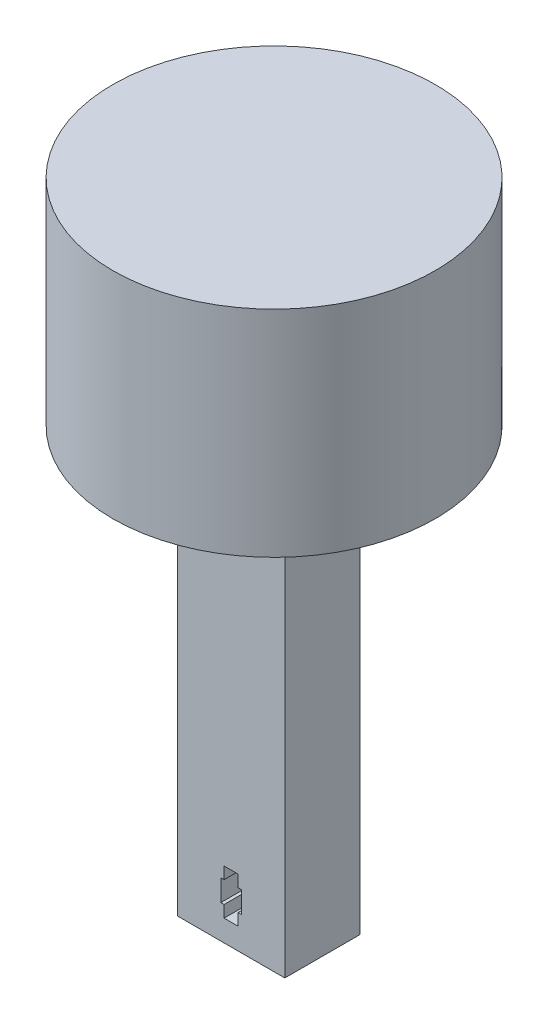
ISO-10303-21;
HEADER;
FILE_DESCRIPTION(('STEP AP214'),'2;1');
FILE_NAME('part.step','',(''),(''),'','','');
FILE_SCHEMA(('AUTOMOTIVE_DESIGN { 1 0 10303 214 1 1 1 1 }'));
ENDSEC;
DATA;
#1=APPLICATION_CONTEXT('core data for automotive mechanical design processes');
#2=APPLICATION_PROTOCOL_DEFINITION('international standard','automotive_design',2000,#1);
#3=PRODUCT_CONTEXT('',#1,'mechanical');
#4=PRODUCT('Part','Part','',(#3));
#5=PRODUCT_RELATED_PRODUCT_CATEGORY('part','',(#4));
#6=PRODUCT_DEFINITION_FORMATION('','',#4);
#7=PRODUCT_DEFINITION_CONTEXT('part definition',#1,'design');
#8=PRODUCT_DEFINITION('design','',#6,#7);
#9=PRODUCT_DEFINITION_SHAPE('','',#8);
#10=(LENGTH_UNIT() NAMED_UNIT(*) SI_UNIT(.MILLI.,.METRE.));
#11=(NAMED_UNIT(*) PLANE_ANGLE_UNIT() SI_UNIT($,.RADIAN.));
#12=(NAMED_UNIT(*) SI_UNIT($,.STERADIAN.) SOLID_ANGLE_UNIT());
#13=UNCERTAINTY_MEASURE_WITH_UNIT(LENGTH_MEASURE(1.E-05),#10,'distance_accuracy_value','');
#14=(GEOMETRIC_REPRESENTATION_CONTEXT(3) GLOBAL_UNCERTAINTY_ASSIGNED_CONTEXT((#13)) GLOBAL_UNIT_ASSIGNED_CONTEXT((#10,
#11,#12)) REPRESENTATION_CONTEXT('',''));
#15=CARTESIAN_POINT('',(0.,0.,0.));
#16=DIRECTION('',(0.,0.,1.));
#17=DIRECTION('',(1.,0.,0.));
#18=AXIS2_PLACEMENT_3D('',#15,#16,#17);
#19=CARTESIAN_POINT('',(0.649999999999998,-38.,-15.));
#20=DIRECTION('',(1.,0.,0.));
#21=DIRECTION('',(0.,0.,-1.));
#22=AXIS2_PLACEMENT_3D('',#19,#20,#21);
#23=PLANE('',#22);
#24=DIRECTION('',(0.,1.,0.));
#25=VECTOR('',#24,1.);
#26=CARTESIAN_POINT('',(0.649999999999998,-38.,4.));
#27=LINE('',#26,#25);
#28=CARTESIAN_POINT('',(0.649999999999998,-38.,4.));
#29=VERTEX_POINT('',#28);
#30=CARTESIAN_POINT('',(0.649999999999998,-36.9,4.));
#31=VERTEX_POINT('',#30);
#32=EDGE_CURVE('E260',#29,#31,#27,.T.);
#33=ORIENTED_EDGE('',*,*,#32,.T.);
#34=DIRECTION('',(0.,0.,-1.));
#35=VECTOR('',#34,1.);
#36=CARTESIAN_POINT('',(0.649999999999998,-36.9,-15.));
#37=LINE('',#36,#35);
#38=CARTESIAN_POINT('',(0.649999999999998,-36.9,-3.));
#39=VERTEX_POINT('',#38);
#40=EDGE_CURVE('E219',#31,#39,#37,.T.);
#41=ORIENTED_EDGE('',*,*,#40,.T.);
#42=DIRECTION('',(0.,1.,0.));
#43=VECTOR('',#42,1.);
#44=CARTESIAN_POINT('',(0.649999999999998,-40.,-3.));
#45=LINE('',#44,#43);
#46=CARTESIAN_POINT('',(0.649999999999999,-38.5,-3.));
#47=VERTEX_POINT('',#46);
#48=EDGE_CURVE('E288',#47,#39,#45,.T.);
#49=ORIENTED_EDGE('',*,*,#48,.F.);
#50=DIRECTION('',(0.,0.,-1.));
#51=VECTOR('',#50,1.);
#52=CARTESIAN_POINT('',(0.649999999999999,-38.5,-1.));
#53=LINE('',#52,#51);
#54=CARTESIAN_POINT('',(0.649999999999999,-38.5,-1.));
#55=VERTEX_POINT('',#54);
#56=EDGE_CURVE('E241',#55,#47,#53,.T.);
#57=ORIENTED_EDGE('',*,*,#56,.F.);
#58=DIRECTION('',(0.,1.,0.));
#59=VECTOR('',#58,1.);
#60=CARTESIAN_POINT('',(0.649999999999999,-38.5,-1.));
#61=LINE('',#60,#59);
#62=CARTESIAN_POINT('',(0.649999999999999,-38.,-1.));
#63=VERTEX_POINT('',#62);
#64=EDGE_CURVE('E229',#55,#63,#61,.T.);
#65=ORIENTED_EDGE('',*,*,#64,.T.);
#66=DIRECTION('',(0.,0.,1.));
#67=VECTOR('',#66,1.);
#68=CARTESIAN_POINT('',(0.649999999999998,-38.,-15.));
#69=LINE('',#68,#67);
#70=EDGE_CURVE('E274',#63,#29,#69,.T.);
#71=ORIENTED_EDGE('',*,*,#70,.T.);
#72=EDGE_LOOP('',(#33,#41,#49,#57,#65,#71));
#73=FACE_BOUND('',#72,.T.);
#74=ADVANCED_FACE('F39',(#73),#23,.F.);
#75=CARTESIAN_POINT('',(-0.650000000000002,-38.,-15.));
#76=DIRECTION('',(-1.,0.,0.));
#77=DIRECTION('',(0.,0.,1.));
#78=AXIS2_PLACEMENT_3D('',#75,#76,#77);
#79=PLANE('',#78);
#80=DIRECTION('',(0.,-1.,0.));
#81=VECTOR('',#80,1.);
#82=CARTESIAN_POINT('',(-0.650000000000001,-40.,-3.));
#83=LINE('',#82,#81);
#84=CARTESIAN_POINT('',(-0.650000000000002,-36.9,-3.));
#85=VERTEX_POINT('',#84);
#86=CARTESIAN_POINT('',(-0.649999999999999,-38.5,-3.));
#87=VERTEX_POINT('',#86);
#88=EDGE_CURVE('E276',#85,#87,#83,.T.);
#89=ORIENTED_EDGE('',*,*,#88,.F.);
#90=DIRECTION('',(0.,0.,1.));
#91=VECTOR('',#90,1.);
#92=CARTESIAN_POINT('',(-0.650000000000002,-36.9,-15.));
#93=LINE('',#92,#91);
#94=CARTESIAN_POINT('',(-0.650000000000002,-36.9,4.));
#95=VERTEX_POINT('',#94);
#96=EDGE_CURVE('E12',#85,#95,#93,.T.);
#97=ORIENTED_EDGE('',*,*,#96,.T.);
#98=DIRECTION('',(0.,-1.,0.));
#99=VECTOR('',#98,1.);
#100=CARTESIAN_POINT('',(-0.650000000000002,-38.,4.));
#101=LINE('',#100,#99);
#102=CARTESIAN_POINT('',(-0.650000000000002,-38.,4.));
#103=VERTEX_POINT('',#102);
#104=EDGE_CURVE('E266',#95,#103,#101,.T.);
#105=ORIENTED_EDGE('',*,*,#104,.T.);
#106=DIRECTION('',(0.,0.,1.));
#107=VECTOR('',#106,1.);
#108=CARTESIAN_POINT('',(-0.650000000000002,-38.,-15.));
#109=LINE('',#108,#107);
#110=CARTESIAN_POINT('',(-0.650000000000002,-38.,-1.));
#111=VERTEX_POINT('',#110);
#112=EDGE_CURVE('E277',#111,#103,#109,.T.);
#113=ORIENTED_EDGE('',*,*,#112,.F.);
#114=DIRECTION('',(0.,-1.,0.));
#115=VECTOR('',#114,1.);
#116=CARTESIAN_POINT('',(-0.649999999999999,-38.5,-1.));
#117=LINE('',#116,#115);
#118=CARTESIAN_POINT('',(-0.649999999999999,-38.5,-1.));
#119=VERTEX_POINT('',#118);
#120=EDGE_CURVE('E235',#111,#119,#117,.T.);
#121=ORIENTED_EDGE('',*,*,#120,.T.);
#122=DIRECTION('',(0.,0.,-1.));
#123=VECTOR('',#122,1.);
#124=CARTESIAN_POINT('',(-0.649999999999999,-38.5,-1.));
#125=LINE('',#124,#123);
#126=EDGE_CURVE('E249',#119,#87,#125,.T.);
#127=ORIENTED_EDGE('',*,*,#126,.T.);
#128=EDGE_LOOP('',(#89,#97,#105,#113,#121,#127));
#129=FACE_BOUND('',#128,.T.);
#130=ADVANCED_FACE('F375',(#129),#79,.F.);
#131=CARTESIAN_POINT('',(5.,-40.,-3.));
#132=DIRECTION('',(0.,0.,1.));
#133=DIRECTION('',(1.,0.,0.));
#134=AXIS2_PLACEMENT_3D('',#131,#132,#133);
#135=PLANE('',#134);
#136=DIRECTION('',(1.,0.,0.));
#137=VECTOR('',#136,1.);
#138=CARTESIAN_POINT('',(5.,0.,-3.));
#139=LINE('',#138,#137);
#140=CARTESIAN_POINT('',(-5.,0.,-3.));
#141=VERTEX_POINT('',#140);
#142=CARTESIAN_POINT('',(5.,0.,-3.));
#143=VERTEX_POINT('',#142);
#144=EDGE_CURVE('E305',#141,#143,#139,.T.);
#145=ORIENTED_EDGE('',*,*,#144,.T.);
#146=DIRECTION('',(0.,1.,0.));
#147=VECTOR('',#146,1.);
#148=CARTESIAN_POINT('',(5.,-40.,-3.));
#149=LINE('',#148,#147);
#150=CARTESIAN_POINT('',(5.,-40.,-3.));
#151=VERTEX_POINT('',#150);
#152=EDGE_CURVE('E318',#151,#143,#149,.T.);
#153=ORIENTED_EDGE('',*,*,#152,.F.);
#154=DIRECTION('',(1.,0.,0.));
#155=VECTOR('',#154,1.);
#156=CARTESIAN_POINT('',(5.,-40.,-3.));
#157=LINE('',#156,#155);
#158=CARTESIAN_POINT('',(-5.,-40.,-3.));
#159=VERTEX_POINT('',#158);
#160=EDGE_CURVE('E295',#159,#151,#157,.T.);
#161=ORIENTED_EDGE('',*,*,#160,.F.);
#162=DIRECTION('',(0.,1.,0.));
#163=VECTOR('',#162,1.);
#164=CARTESIAN_POINT('',(-5.,-40.,-3.));
#165=LINE('',#164,#163);
#166=EDGE_CURVE('E321',#159,#141,#165,.T.);
#167=ORIENTED_EDGE('',*,*,#166,.T.);
#168=EDGE_LOOP('',(#145,#153,#161,#167));
#169=FACE_BOUND('',#168,.T.);
#170=ORIENTED_EDGE('',*,*,#48,.T.);
#171=DIRECTION('',(1.,0.,0.));
#172=VECTOR('',#171,1.);
#173=CARTESIAN_POINT('',(5.,-36.9,-3.));
#174=LINE('',#173,#172);
#175=CARTESIAN_POINT('',(0.95,-36.9,-3.));
#176=VERTEX_POINT('',#175);
#177=EDGE_CURVE('E220',#39,#176,#174,.T.);
#178=ORIENTED_EDGE('',*,*,#177,.T.);
#179=DIRECTION('',(0.,1.,0.));
#180=VECTOR('',#179,1.);
#181=CARTESIAN_POINT('',(0.95,-40.,-3.));
#182=LINE('',#181,#180);
#183=CARTESIAN_POINT('',(0.95,-34.9,-3.));
#184=VERTEX_POINT('',#183);
#185=EDGE_CURVE('E226',#176,#184,#182,.T.);
#186=ORIENTED_EDGE('',*,*,#185,.T.);
#187=DIRECTION('',(-1.,0.,0.));
#188=VECTOR('',#187,1.);
#189=CARTESIAN_POINT('',(5.,-34.9,-3.));
#190=LINE('',#189,#188);
#191=CARTESIAN_POINT('',(0.649999999999998,-34.9,-3.));
#192=VERTEX_POINT('',#191);
#193=EDGE_CURVE('E179',#184,#192,#190,.T.);
#194=ORIENTED_EDGE('',*,*,#193,.T.);
#195=CARTESIAN_POINT('',(0.649999999999999,-33.3,-3.));
#196=VERTEX_POINT('',#195);
#197=EDGE_CURVE('E287',#192,#196,#45,.T.);
#198=ORIENTED_EDGE('',*,*,#197,.T.);
#199=DIRECTION('',(-1.,0.,0.));
#200=VECTOR('',#199,1.);
#201=CARTESIAN_POINT('',(-0.649999999999999,-33.3,-3.));
#202=LINE('',#201,#200);
#203=CARTESIAN_POINT('',(-0.649999999999999,-33.3,-3.));
#204=VERTEX_POINT('',#203);
#205=EDGE_CURVE('E228',#196,#204,#202,.T.);
#206=ORIENTED_EDGE('',*,*,#205,.T.);
#207=CARTESIAN_POINT('',(-0.650000000000001,-34.9,-3.));
#208=VERTEX_POINT('',#207);
#209=EDGE_CURVE('E284',#204,#208,#83,.T.);
#210=ORIENTED_EDGE('',*,*,#209,.T.);
#211=CARTESIAN_POINT('',(-0.95,-34.9,-3.));
#212=VERTEX_POINT('',#211);
#213=EDGE_CURVE('E62',#208,#212,#190,.T.);
#214=ORIENTED_EDGE('',*,*,#213,.T.);
#215=DIRECTION('',(0.,-1.,0.));
#216=VECTOR('',#215,1.);
#217=CARTESIAN_POINT('',(-0.95,-40.,-3.));
#218=LINE('',#217,#216);
#219=CARTESIAN_POINT('',(-0.95,-36.9,-3.));
#220=VERTEX_POINT('',#219);
#221=EDGE_CURVE('E223',#212,#220,#218,.T.);
#222=ORIENTED_EDGE('',*,*,#221,.T.);
#223=EDGE_CURVE('E216',#220,#85,#174,.T.);
#224=ORIENTED_EDGE('',*,*,#223,.T.);
#225=ORIENTED_EDGE('',*,*,#88,.T.);
#226=DIRECTION('',(1.,0.,0.));
#227=VECTOR('',#226,1.);
#228=CARTESIAN_POINT('',(-0.649999999999999,-38.5,-3.));
#229=LINE('',#228,#227);
#230=EDGE_CURVE('E244',#87,#47,#229,.T.);
#231=ORIENTED_EDGE('',*,*,#230,.T.);
#232=EDGE_LOOP('',(#170,#178,#186,#194,#198,#206,#210,#214,#222,#224,#225,#231));
#233=FACE_BOUND('',#232,.T.);
#234=ADVANCED_FACE('F349',(#169,#233),#135,.F.);
#235=CARTESIAN_POINT('',(-0.650000000000002,-38.,-15.));
#236=DIRECTION('',(0.,-1.,0.));
#237=DIRECTION('',(0.,0.,-1.));
#238=AXIS2_PLACEMENT_3D('',#235,#236,#237);
#239=PLANE('',#238);
#240=DIRECTION('',(1.,0.,0.));
#241=VECTOR('',#240,1.);
#242=CARTESIAN_POINT('',(-0.650000000000002,-38.,-1.));
#243=LINE('',#242,#241);
#244=EDGE_CURVE('E258',#111,#63,#243,.T.);
#245=ORIENTED_EDGE('',*,*,#244,.F.);
#246=ORIENTED_EDGE('',*,*,#112,.T.);
#247=DIRECTION('',(1.,0.,0.));
#248=VECTOR('',#247,1.);
#249=CARTESIAN_POINT('',(-0.650000000000002,-38.,4.));
#250=LINE('',#249,#248);
#251=EDGE_CURVE('E270',#103,#29,#250,.T.);
#252=ORIENTED_EDGE('',*,*,#251,.T.);
#253=ORIENTED_EDGE('',*,*,#70,.F.);
#254=EDGE_LOOP('',(#245,#246,#252,#253));
#255=FACE_BOUND('',#254,.T.);
#256=ADVANCED_FACE('F393',(#255),#239,.F.);
#257=CARTESIAN_POINT('',(-0.650000000000002,-33.8,-15.));
#258=DIRECTION('',(0.,1.,0.));
#259=DIRECTION('',(0.,0.,1.));
#260=AXIS2_PLACEMENT_3D('',#257,#258,#259);
#261=PLANE('',#260);
#262=DIRECTION('',(-1.,0.,0.));
#263=VECTOR('',#262,1.);
#264=CARTESIAN_POINT('',(-0.650000000000002,-33.8,-1.));
#265=LINE('',#264,#263);
#266=CARTESIAN_POINT('',(0.649999999999998,-33.8,-1.));
#267=VERTEX_POINT('',#266);
#268=CARTESIAN_POINT('',(-0.649999999999999,-33.8,-1.));
#269=VERTEX_POINT('',#268);
#270=EDGE_CURVE('E340',#267,#269,#265,.T.);
#271=ORIENTED_EDGE('',*,*,#270,.F.);
#272=DIRECTION('',(0.,0.,1.));
#273=VECTOR('',#272,1.);
#274=CARTESIAN_POINT('',(0.649999999999998,-33.8,-15.));
#275=LINE('',#274,#273);
#276=CARTESIAN_POINT('',(0.649999999999999,-33.8,4.));
#277=VERTEX_POINT('',#276);
#278=EDGE_CURVE('E273',#267,#277,#275,.T.);
#279=ORIENTED_EDGE('',*,*,#278,.T.);
#280=DIRECTION('',(-1.,0.,0.));
#281=VECTOR('',#280,1.);
#282=CARTESIAN_POINT('',(-0.650000000000002,-33.8,4.));
#283=LINE('',#282,#281);
#284=CARTESIAN_POINT('',(-0.650000000000002,-33.8,4.));
#285=VERTEX_POINT('',#284);
#286=EDGE_CURVE('E263',#277,#285,#283,.T.);
#287=ORIENTED_EDGE('',*,*,#286,.T.);
#288=DIRECTION('',(0.,0.,1.));
#289=VECTOR('',#288,1.);
#290=CARTESIAN_POINT('',(-0.650000000000002,-33.8,-15.));
#291=LINE('',#290,#289);
#292=EDGE_CURVE('E280',#269,#285,#291,.T.);
#293=ORIENTED_EDGE('',*,*,#292,.F.);
#294=EDGE_LOOP('',(#271,#279,#287,#293));
#295=FACE_BOUND('',#294,.T.);
#296=ADVANCED_FACE('F365',(#295),#261,.F.);
#297=CARTESIAN_POINT('',(0.,0.,0.));
#298=DIRECTION('',(0.,1.,0.));
#299=DIRECTION('',(0.,0.,1.));
#300=AXIS2_PLACEMENT_3D('',#297,#298,#299);
#301=PLANE('',#300);
#302=CARTESIAN_POINT('',(0.,0.,0.));
#303=DIRECTION('',(0.,1.,0.));
#304=DIRECTION('',(0.,0.,1.));
#305=AXIS2_PLACEMENT_3D('',#302,#303,#304);
#306=CIRCLE('',#305,15.);
#307=CARTESIAN_POINT('',(0.,0.,15.));
#308=VERTEX_POINT('',#307);
#309=EDGE_CURVE('E328',#308,#308,#306,.T.);
#310=ORIENTED_EDGE('',*,*,#309,.F.);
#311=EDGE_LOOP('',(#310));
#312=FACE_BOUND('',#311,.T.);
#313=CARTESIAN_POINT('',(-12.,0.,0.));
#314=DIRECTION('',(0.,-1.,0.));
#315=DIRECTION('',(0.,0.,1.));
#316=AXIS2_PLACEMENT_3D('',#313,#314,#315);
#317=CIRCLE('',#316,1.5);
#318=CARTESIAN_POINT('',(-12.,0.,1.5));
#319=VERTEX_POINT('',#318);
#320=EDGE_CURVE('E324',#319,#319,#317,.T.);
#321=ORIENTED_EDGE('',*,*,#320,.F.);
#322=EDGE_LOOP('',(#321));
#323=FACE_BOUND('',#322,.T.);
#324=CARTESIAN_POINT('',(12.,0.,0.));
#325=DIRECTION('',(0.,-1.,0.));
#326=DIRECTION('',(0.,0.,-1.));
#327=AXIS2_PLACEMENT_3D('',#324,#325,#326);
#328=CIRCLE('',#327,1.5);
#329=CARTESIAN_POINT('',(12.,0.,-1.5));
#330=VERTEX_POINT('',#329);
#331=EDGE_CURVE('E329',#330,#330,#328,.T.);
#332=ORIENTED_EDGE('',*,*,#331,.F.);
#333=EDGE_LOOP('',(#332));
#334=FACE_BOUND('',#333,.T.);
#335=DIRECTION('',(0.,0.,-1.));
#336=VECTOR('',#335,1.);
#337=CARTESIAN_POINT('',(-5.,0.,-3.));
#338=LINE('',#337,#336);
#339=CARTESIAN_POINT('',(-5.,0.,4.));
#340=VERTEX_POINT('',#339);
#341=EDGE_CURVE('E291',#340,#141,#338,.T.);
#342=ORIENTED_EDGE('',*,*,#341,.F.);
#343=DIRECTION('',(-1.,0.,0.));
#344=VECTOR('',#343,1.);
#345=CARTESIAN_POINT('',(5.,0.,4.));
#346=LINE('',#345,#344);
#347=CARTESIAN_POINT('',(5.,0.,4.));
#348=VERTEX_POINT('',#347);
#349=EDGE_CURVE('E296',#348,#340,#346,.T.);
#350=ORIENTED_EDGE('',*,*,#349,.F.);
#351=DIRECTION('',(0.,0.,1.));
#352=VECTOR('',#351,1.);
#353=CARTESIAN_POINT('',(5.,0.,-3.));
#354=LINE('',#353,#352);
#355=EDGE_CURVE('E308',#143,#348,#354,.T.);
#356=ORIENTED_EDGE('',*,*,#355,.F.);
#357=ORIENTED_EDGE('',*,*,#144,.F.);
#358=EDGE_LOOP('',(#342,#350,#356,#357));
#359=FACE_BOUND('',#358,.T.);
#360=ADVANCED_FACE('F460',(#312,#323,#334,#359),#301,.F.);
#361=CARTESIAN_POINT('',(0.,20.,0.));
#362=DIRECTION('',(0.,-1.,0.));
#363=DIRECTION('',(0.,0.,-1.));
#364=AXIS2_PLACEMENT_3D('',#361,#362,#363);
#365=CYLINDRICAL_SURFACE('',#364,15.);
#366=CARTESIAN_POINT('',(0.,20.,0.));
#367=DIRECTION('',(0.,1.,0.));
#368=DIRECTION('',(0.,0.,1.));
#369=AXIS2_PLACEMENT_3D('',#366,#367,#368);
#370=CIRCLE('',#369,15.);
#371=CARTESIAN_POINT('',(0.,20.,15.));
#372=VERTEX_POINT('',#371);
#373=EDGE_CURVE('E337',#372,#372,#370,.T.);
#374=ORIENTED_EDGE('',*,*,#373,.F.);
#375=EDGE_LOOP('',(#374));
#376=FACE_BOUND('',#375,.T.);
#377=ORIENTED_EDGE('',*,*,#309,.T.);
#378=EDGE_LOOP('',(#377));
#379=FACE_BOUND('',#378,.T.);
#380=ADVANCED_FACE('F41',(#376,#379),#365,.T.);
#381=CARTESIAN_POINT('',(0.,20.,0.));
#382=DIRECTION('',(0.,1.,0.));
#383=DIRECTION('',(0.,0.,1.));
#384=AXIS2_PLACEMENT_3D('',#381,#382,#383);
#385=PLANE('',#384);
#386=ORIENTED_EDGE('',*,*,#373,.T.);
#387=EDGE_LOOP('',(#386));
#388=FACE_BOUND('',#387,.T.);
#389=ADVANCED_FACE('F456',(#388),#385,.T.);
#390=CARTESIAN_POINT('',(-12.,15.,0.));
#391=DIRECTION('',(0.,-1.,0.));
#392=DIRECTION('',(0.,0.,-1.));
#393=AXIS2_PLACEMENT_3D('',#390,#391,#392);
#394=CYLINDRICAL_SURFACE('',#393,1.5);
#395=CARTESIAN_POINT('',(-12.,15.,0.));
#396=DIRECTION('',(0.,-1.,0.));
#397=DIRECTION('',(0.,0.,1.));
#398=AXIS2_PLACEMENT_3D('',#395,#396,#397);
#399=CIRCLE('',#398,1.5);
#400=CARTESIAN_POINT('',(-12.,15.,1.5));
#401=VERTEX_POINT('',#400);
#402=EDGE_CURVE('E332',#401,#401,#399,.T.);
#403=ORIENTED_EDGE('',*,*,#402,.F.);
#404=EDGE_LOOP('',(#403));
#405=FACE_BOUND('',#404,.T.);
#406=ORIENTED_EDGE('',*,*,#320,.T.);
#407=EDGE_LOOP('',(#406));
#408=FACE_BOUND('',#407,.T.);
#409=ADVANCED_FACE('F452',(#405,#408),#394,.F.);
#410=CARTESIAN_POINT('',(-12.,15.,0.));
#411=DIRECTION('',(0.,1.,0.));
#412=DIRECTION('',(0.,0.,1.));
#413=AXIS2_PLACEMENT_3D('',#410,#411,#412);
#414=PLANE('',#413);
#415=ORIENTED_EDGE('',*,*,#402,.T.);
#416=EDGE_LOOP('',(#415));
#417=FACE_BOUND('',#416,.T.);
#418=ADVANCED_FACE('F448',(#417),#414,.F.);
#419=CARTESIAN_POINT('',(12.,15.,0.));
#420=DIRECTION('',(0.,-1.,0.));
#421=DIRECTION('',(0.,0.,-1.));
#422=AXIS2_PLACEMENT_3D('',#419,#420,#421);
#423=CYLINDRICAL_SURFACE('',#422,1.5);
#424=CARTESIAN_POINT('',(12.,15.,0.));
#425=DIRECTION('',(0.,-1.,0.));
#426=DIRECTION('',(0.,0.,-1.));
#427=AXIS2_PLACEMENT_3D('',#424,#425,#426);
#428=CIRCLE('',#427,1.5);
#429=CARTESIAN_POINT('',(12.,15.,-1.5));
#430=VERTEX_POINT('',#429);
#431=EDGE_CURVE('E325',#430,#430,#428,.T.);
#432=ORIENTED_EDGE('',*,*,#431,.F.);
#433=EDGE_LOOP('',(#432));
#434=FACE_BOUND('',#433,.T.);
#435=ORIENTED_EDGE('',*,*,#331,.T.);
#436=EDGE_LOOP('',(#435));
#437=FACE_BOUND('',#436,.T.);
#438=ADVANCED_FACE('F444',(#434,#437),#423,.F.);
#439=CARTESIAN_POINT('',(12.,15.,0.));
#440=DIRECTION('',(0.,-1.,0.));
#441=DIRECTION('',(0.,0.,-1.));
#442=AXIS2_PLACEMENT_3D('',#439,#440,#441);
#443=PLANE('',#442);
#444=ORIENTED_EDGE('',*,*,#431,.T.);
#445=EDGE_LOOP('',(#444));
#446=FACE_BOUND('',#445,.T.);
#447=ADVANCED_FACE('F440',(#446),#443,.T.);
#448=CARTESIAN_POINT('',(-5.,-40.,-3.));
#449=DIRECTION('',(1.,0.,0.));
#450=DIRECTION('',(0.,0.,-1.));
#451=AXIS2_PLACEMENT_3D('',#448,#449,#450);
#452=PLANE('',#451);
#453=ORIENTED_EDGE('',*,*,#341,.T.);
#454=ORIENTED_EDGE('',*,*,#166,.F.);
#455=DIRECTION('',(0.,0.,-1.));
#456=VECTOR('',#455,1.);
#457=CARTESIAN_POINT('',(-5.,-40.,-3.));
#458=LINE('',#457,#456);
#459=CARTESIAN_POINT('',(-5.,-40.,4.));
#460=VERTEX_POINT('',#459);
#461=EDGE_CURVE('E292',#460,#159,#458,.T.);
#462=ORIENTED_EDGE('',*,*,#461,.F.);
#463=DIRECTION('',(0.,1.,0.));
#464=VECTOR('',#463,1.);
#465=CARTESIAN_POINT('',(-5.,-40.,4.));
#466=LINE('',#465,#464);
#467=EDGE_CURVE('E302',#460,#340,#466,.T.);
#468=ORIENTED_EDGE('',*,*,#467,.T.);
#469=EDGE_LOOP('',(#453,#454,#462,#468));
#470=FACE_BOUND('',#469,.T.);
#471=ADVANCED_FACE('F433',(#470),#452,.F.);
#472=CARTESIAN_POINT('',(5.,-40.,-3.));
#473=DIRECTION('',(-1.,0.,0.));
#474=DIRECTION('',(0.,0.,1.));
#475=AXIS2_PLACEMENT_3D('',#472,#473,#474);
#476=PLANE('',#475);
#477=ORIENTED_EDGE('',*,*,#355,.T.);
#478=DIRECTION('',(0.,1.,0.));
#479=VECTOR('',#478,1.);
#480=CARTESIAN_POINT('',(5.,-40.,4.));
#481=LINE('',#480,#479);
#482=CARTESIAN_POINT('',(5.,-40.,4.));
#483=VERTEX_POINT('',#482);
#484=EDGE_CURVE('E315',#483,#348,#481,.T.);
#485=ORIENTED_EDGE('',*,*,#484,.F.);
#486=DIRECTION('',(0.,0.,1.));
#487=VECTOR('',#486,1.);
#488=CARTESIAN_POINT('',(5.,-40.,-3.));
#489=LINE('',#488,#487);
#490=EDGE_CURVE('E298',#151,#483,#489,.T.);
#491=ORIENTED_EDGE('',*,*,#490,.F.);
#492=ORIENTED_EDGE('',*,*,#152,.T.);
#493=EDGE_LOOP('',(#477,#485,#491,#492));
#494=FACE_BOUND('',#493,.T.);
#495=ADVANCED_FACE('F428',(#494),#476,.F.);
#496=CARTESIAN_POINT('',(5.,-40.,4.));
#497=DIRECTION('',(0.,0.,-1.));
#498=DIRECTION('',(-1.,0.,0.));
#499=AXIS2_PLACEMENT_3D('',#496,#497,#498);
#500=PLANE('',#499);
#501=ORIENTED_EDGE('',*,*,#104,.F.);
#502=DIRECTION('',(1.,0.,0.));
#503=VECTOR('',#502,1.);
#504=CARTESIAN_POINT('',(-0.95,-36.9,4.));
#505=LINE('',#504,#503);
#506=CARTESIAN_POINT('',(-0.95,-36.9,4.));
#507=VERTEX_POINT('',#506);
#508=EDGE_CURVE('E183',#507,#95,#505,.T.);
#509=ORIENTED_EDGE('',*,*,#508,.F.);
#510=DIRECTION('',(0.,-1.,0.));
#511=VECTOR('',#510,1.);
#512=CARTESIAN_POINT('',(-0.95,-36.9,4.));
#513=LINE('',#512,#511);
#514=CARTESIAN_POINT('',(-0.95,-34.9,4.));
#515=VERTEX_POINT('',#514);
#516=EDGE_CURVE('E201',#515,#507,#513,.T.);
#517=ORIENTED_EDGE('',*,*,#516,.F.);
#518=DIRECTION('',(-1.,0.,0.));
#519=VECTOR('',#518,1.);
#520=CARTESIAN_POINT('',(-0.95,-34.9,4.));
#521=LINE('',#520,#519);
#522=CARTESIAN_POINT('',(-0.650000000000002,-34.9,4.));
#523=VERTEX_POINT('',#522);
#524=EDGE_CURVE('E193',#523,#515,#521,.T.);
#525=ORIENTED_EDGE('',*,*,#524,.F.);
#526=EDGE_CURVE('E267',#285,#523,#101,.T.);
#527=ORIENTED_EDGE('',*,*,#526,.F.);
#528=ORIENTED_EDGE('',*,*,#286,.F.);
#529=CARTESIAN_POINT('',(0.649999999999998,-34.9,4.));
#530=VERTEX_POINT('',#529);
#531=EDGE_CURVE('E200',#530,#277,#27,.T.);
#532=ORIENTED_EDGE('',*,*,#531,.F.);
#533=CARTESIAN_POINT('',(0.95,-34.9,4.));
#534=VERTEX_POINT('',#533);
#535=EDGE_CURVE('E54',#534,#530,#521,.T.);
#536=ORIENTED_EDGE('',*,*,#535,.F.);
#537=DIRECTION('',(0.,1.,0.));
#538=VECTOR('',#537,1.);
#539=CARTESIAN_POINT('',(0.95,-36.9,4.));
#540=LINE('',#539,#538);
#541=CARTESIAN_POINT('',(0.95,-36.9,4.));
#542=VERTEX_POINT('',#541);
#543=EDGE_CURVE('E186',#542,#534,#540,.T.);
#544=ORIENTED_EDGE('',*,*,#543,.F.);
#545=EDGE_CURVE('E204',#31,#542,#505,.T.);
#546=ORIENTED_EDGE('',*,*,#545,.F.);
#547=ORIENTED_EDGE('',*,*,#32,.F.);
#548=ORIENTED_EDGE('',*,*,#251,.F.);
#549=EDGE_LOOP('',(#501,#509,#517,#525,#527,#528,#532,#536,#544,#546,#547,#548));
#550=FACE_BOUND('',#549,.T.);
#551=ORIENTED_EDGE('',*,*,#349,.T.);
#552=ORIENTED_EDGE('',*,*,#467,.F.);
#553=DIRECTION('',(-1.,0.,0.));
#554=VECTOR('',#553,1.);
#555=CARTESIAN_POINT('',(5.,-40.,4.));
#556=LINE('',#555,#554);
#557=EDGE_CURVE('E300',#483,#460,#556,.T.);
#558=ORIENTED_EDGE('',*,*,#557,.F.);
#559=ORIENTED_EDGE('',*,*,#484,.T.);
#560=EDGE_LOOP('',(#551,#552,#558,#559));
#561=FACE_BOUND('',#560,.T.);
#562=ADVANCED_FACE('F197',(#550,#561),#500,.F.);
#563=CARTESIAN_POINT('',(0.,-40.,0.));
#564=DIRECTION('',(0.,-1.,0.));
#565=DIRECTION('',(0.,0.,-1.));
#566=AXIS2_PLACEMENT_3D('',#563,#564,#565);
#567=PLANE('',#566);
#568=ORIENTED_EDGE('',*,*,#461,.T.);
#569=ORIENTED_EDGE('',*,*,#160,.T.);
#570=ORIENTED_EDGE('',*,*,#490,.T.);
#571=ORIENTED_EDGE('',*,*,#557,.T.);
#572=EDGE_LOOP('',(#568,#569,#570,#571));
#573=FACE_BOUND('',#572,.T.);
#574=ADVANCED_FACE('F417',(#573),#567,.T.);
#575=ORIENTED_EDGE('',*,*,#197,.F.);
#576=DIRECTION('',(0.,0.,1.));
#577=VECTOR('',#576,1.);
#578=CARTESIAN_POINT('',(0.649999999999998,-34.9,-15.));
#579=LINE('',#578,#577);
#580=EDGE_CURVE('E214',#192,#530,#579,.T.);
#581=ORIENTED_EDGE('',*,*,#580,.T.);
#582=ORIENTED_EDGE('',*,*,#531,.T.);
#583=ORIENTED_EDGE('',*,*,#278,.F.);
#584=CARTESIAN_POINT('',(0.649999999999999,-33.3,-1.));
#585=VERTEX_POINT('',#584);
#586=EDGE_CURVE('E233',#267,#585,#61,.T.);
#587=ORIENTED_EDGE('',*,*,#586,.T.);
#588=DIRECTION('',(0.,0.,-1.));
#589=VECTOR('',#588,1.);
#590=CARTESIAN_POINT('',(0.649999999999999,-33.3,-1.));
#591=LINE('',#590,#589);
#592=EDGE_CURVE('E255',#585,#196,#591,.T.);
#593=ORIENTED_EDGE('',*,*,#592,.T.);
#594=EDGE_LOOP('',(#575,#581,#582,#583,#587,#593));
#595=FACE_BOUND('',#594,.T.);
#596=ADVANCED_FACE('F356',(#595),#23,.F.);
#597=ORIENTED_EDGE('',*,*,#526,.T.);
#598=DIRECTION('',(0.,0.,-1.));
#599=VECTOR('',#598,1.);
#600=CARTESIAN_POINT('',(-0.650000000000002,-34.9,-15.));
#601=LINE('',#600,#599);
#602=EDGE_CURVE('E47',#523,#208,#601,.T.);
#603=ORIENTED_EDGE('',*,*,#602,.T.);
#604=ORIENTED_EDGE('',*,*,#209,.F.);
#605=DIRECTION('',(0.,0.,-1.));
#606=VECTOR('',#605,1.);
#607=CARTESIAN_POINT('',(-0.649999999999999,-33.3,-1.));
#608=LINE('',#607,#606);
#609=CARTESIAN_POINT('',(-0.649999999999999,-33.3,-1.));
#610=VERTEX_POINT('',#609);
#611=EDGE_CURVE('E252',#610,#204,#608,.T.);
#612=ORIENTED_EDGE('',*,*,#611,.F.);
#613=EDGE_CURVE('E236',#610,#269,#117,.T.);
#614=ORIENTED_EDGE('',*,*,#613,.T.);
#615=ORIENTED_EDGE('',*,*,#292,.T.);
#616=EDGE_LOOP('',(#597,#603,#604,#612,#614,#615));
#617=FACE_BOUND('',#616,.T.);
#618=ADVANCED_FACE('F344',(#617),#79,.F.);
#619=CARTESIAN_POINT('',(0.,0.,-1.));
#620=DIRECTION('',(0.,0.,-1.));
#621=DIRECTION('',(-1.,0.,0.));
#622=AXIS2_PLACEMENT_3D('',#619,#620,#621);
#623=PLANE('',#622);
#624=ORIENTED_EDGE('',*,*,#270,.T.);
#625=ORIENTED_EDGE('',*,*,#613,.F.);
#626=DIRECTION('',(-1.,0.,0.));
#627=VECTOR('',#626,1.);
#628=CARTESIAN_POINT('',(-0.649999999999999,-33.3,-1.));
#629=LINE('',#628,#627);
#630=EDGE_CURVE('E232',#585,#610,#629,.T.);
#631=ORIENTED_EDGE('',*,*,#630,.F.);
#632=ORIENTED_EDGE('',*,*,#586,.F.);
#633=EDGE_LOOP('',(#624,#625,#631,#632));
#634=FACE_BOUND('',#633,.T.);
#635=ADVANCED_FACE('F362',(#634),#623,.T.);
#636=CARTESIAN_POINT('',(-0.649999999999999,-33.3,-1.));
#637=DIRECTION('',(0.,-1.,0.));
#638=DIRECTION('',(0.,0.,-1.));
#639=AXIS2_PLACEMENT_3D('',#636,#637,#638);
#640=PLANE('',#639);
#641=ORIENTED_EDGE('',*,*,#205,.F.);
#642=ORIENTED_EDGE('',*,*,#592,.F.);
#643=ORIENTED_EDGE('',*,*,#630,.T.);
#644=ORIENTED_EDGE('',*,*,#611,.T.);
#645=EDGE_LOOP('',(#641,#642,#643,#644));
#646=FACE_BOUND('',#645,.T.);
#647=ADVANCED_FACE('F354',(#646),#640,.T.);
#648=ORIENTED_EDGE('',*,*,#244,.T.);
#649=ORIENTED_EDGE('',*,*,#64,.F.);
#650=DIRECTION('',(1.,0.,0.));
#651=VECTOR('',#650,1.);
#652=CARTESIAN_POINT('',(-0.649999999999999,-38.5,-1.));
#653=LINE('',#652,#651);
#654=EDGE_CURVE('E239',#119,#55,#653,.T.);
#655=ORIENTED_EDGE('',*,*,#654,.F.);
#656=ORIENTED_EDGE('',*,*,#120,.F.);
#657=EDGE_LOOP('',(#648,#649,#655,#656));
#658=FACE_BOUND('',#657,.T.);
#659=ADVANCED_FACE('F395',(#658),#623,.T.);
#660=CARTESIAN_POINT('',(-0.649999999999999,-38.5,-1.));
#661=DIRECTION('',(0.,1.,0.));
#662=DIRECTION('',(-1.,0.,0.));
#663=AXIS2_PLACEMENT_3D('',#660,#661,#662);
#664=PLANE('',#663);
#665=ORIENTED_EDGE('',*,*,#230,.F.);
#666=ORIENTED_EDGE('',*,*,#126,.F.);
#667=ORIENTED_EDGE('',*,*,#654,.T.);
#668=ORIENTED_EDGE('',*,*,#56,.T.);
#669=EDGE_LOOP('',(#665,#666,#667,#668));
#670=FACE_BOUND('',#669,.T.);
#671=ADVANCED_FACE('F381',(#670),#664,.T.);
#672=CARTESIAN_POINT('',(-0.95,-36.9,-15.));
#673=DIRECTION('',(0.,-1.,0.));
#674=DIRECTION('',(0.,0.,-1.));
#675=AXIS2_PLACEMENT_3D('',#672,#673,#674);
#676=PLANE('',#675);
#677=DIRECTION('',(0.,0.,1.));
#678=VECTOR('',#677,1.);
#679=CARTESIAN_POINT('',(-0.95,-36.9,-15.));
#680=LINE('',#679,#678);
#681=EDGE_CURVE('E210',#220,#507,#680,.T.);
#682=ORIENTED_EDGE('',*,*,#681,.T.);
#683=ORIENTED_EDGE('',*,*,#508,.T.);
#684=ORIENTED_EDGE('',*,*,#96,.F.);
#685=ORIENTED_EDGE('',*,*,#223,.F.);
#686=EDGE_LOOP('',(#682,#683,#684,#685));
#687=FACE_BOUND('',#686,.T.);
#688=ADVANCED_FACE('F402',(#687),#676,.F.);
#689=CARTESIAN_POINT('',(-0.95,-34.9,-15.));
#690=DIRECTION('',(0.,1.,0.));
#691=DIRECTION('',(0.,0.,1.));
#692=AXIS2_PLACEMENT_3D('',#689,#690,#691);
#693=PLANE('',#692);
#694=ORIENTED_EDGE('',*,*,#602,.F.);
#695=ORIENTED_EDGE('',*,*,#524,.T.);
#696=DIRECTION('',(0.,0.,1.));
#697=VECTOR('',#696,1.);
#698=CARTESIAN_POINT('',(-0.95,-34.9,-15.));
#699=LINE('',#698,#697);
#700=EDGE_CURVE('E182',#212,#515,#699,.T.);
#701=ORIENTED_EDGE('',*,*,#700,.F.);
#702=ORIENTED_EDGE('',*,*,#213,.F.);
#703=EDGE_LOOP('',(#694,#695,#701,#702));
#704=FACE_BOUND('',#703,.T.);
#705=ADVANCED_FACE('F368',(#704),#693,.F.);
#706=CARTESIAN_POINT('',(-0.95,-36.9,-15.));
#707=DIRECTION('',(-1.,0.,0.));
#708=DIRECTION('',(0.,0.,1.));
#709=AXIS2_PLACEMENT_3D('',#706,#707,#708);
#710=PLANE('',#709);
#711=ORIENTED_EDGE('',*,*,#700,.T.);
#712=ORIENTED_EDGE('',*,*,#516,.T.);
#713=ORIENTED_EDGE('',*,*,#681,.F.);
#714=ORIENTED_EDGE('',*,*,#221,.F.);
#715=EDGE_LOOP('',(#711,#712,#713,#714));
#716=FACE_BOUND('',#715,.T.);
#717=ADVANCED_FACE('F370',(#716),#710,.F.);
#718=CARTESIAN_POINT('',(0.95,-36.9,-15.));
#719=DIRECTION('',(1.,0.,0.));
#720=DIRECTION('',(0.,0.,-1.));
#721=AXIS2_PLACEMENT_3D('',#718,#719,#720);
#722=PLANE('',#721);
#723=DIRECTION('',(0.,0.,1.));
#724=VECTOR('',#723,1.);
#725=CARTESIAN_POINT('',(0.95,-36.9,-15.));
#726=LINE('',#725,#724);
#727=EDGE_CURVE('E189',#176,#542,#726,.T.);
#728=ORIENTED_EDGE('',*,*,#727,.T.);
#729=ORIENTED_EDGE('',*,*,#543,.T.);
#730=DIRECTION('',(0.,0.,1.));
#731=VECTOR('',#730,1.);
#732=CARTESIAN_POINT('',(0.95,-34.9,-15.));
#733=LINE('',#732,#731);
#734=EDGE_CURVE('E175',#184,#534,#733,.T.);
#735=ORIENTED_EDGE('',*,*,#734,.F.);
#736=ORIENTED_EDGE('',*,*,#185,.F.);
#737=EDGE_LOOP('',(#728,#729,#735,#736));
#738=FACE_BOUND('',#737,.T.);
#739=ADVANCED_FACE('F187',(#738),#722,.F.);
#740=ORIENTED_EDGE('',*,*,#40,.F.);
#741=ORIENTED_EDGE('',*,*,#545,.T.);
#742=ORIENTED_EDGE('',*,*,#727,.F.);
#743=ORIENTED_EDGE('',*,*,#177,.F.);
#744=EDGE_LOOP('',(#740,#741,#742,#743));
#745=FACE_BOUND('',#744,.T.);
#746=ADVANCED_FACE('F388',(#745),#676,.F.);
#747=ORIENTED_EDGE('',*,*,#734,.T.);
#748=ORIENTED_EDGE('',*,*,#535,.T.);
#749=ORIENTED_EDGE('',*,*,#580,.F.);
#750=ORIENTED_EDGE('',*,*,#193,.F.);
#751=EDGE_LOOP('',(#747,#748,#749,#750));
#752=FACE_BOUND('',#751,.T.);
#753=ADVANCED_FACE('F177',(#752),#693,.F.);
#754=CLOSED_SHELL('',(#74,#130,#234,#256,#296,#360,#380,#389,#409,#418,#438,#447,#471,#495,#562,
#574,#596,#618,#635,#647,#659,#671,#688,#705,#717,#739,#746,#753));
#755=MANIFOLD_SOLID_BREP('B2',#754);
#756=ADVANCED_BREP_SHAPE_REPRESENTATION('',(#18,#755),#14);
#757=SHAPE_DEFINITION_REPRESENTATION(#9,#756);
ENDSEC;
END-ISO-10303-21;
